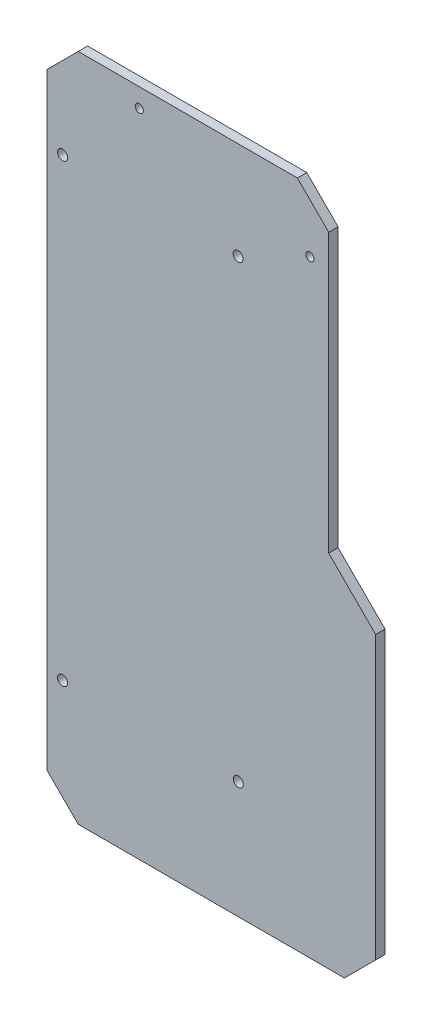
ISO-10303-21;
HEADER;
FILE_DESCRIPTION(('STEP AP214'),'2;1');
FILE_NAME('part.step','',(''),(''),'','','');
FILE_SCHEMA(('AUTOMOTIVE_DESIGN { 1 0 10303 214 1 1 1 1 }'));
ENDSEC;
DATA;
#1=APPLICATION_CONTEXT('core data for automotive mechanical design processes');
#2=APPLICATION_PROTOCOL_DEFINITION('international standard','automotive_design',2000,#1);
#3=PRODUCT_CONTEXT('',#1,'mechanical');
#4=PRODUCT('Part','Part','',(#3));
#5=PRODUCT_RELATED_PRODUCT_CATEGORY('part','',(#4));
#6=PRODUCT_DEFINITION_FORMATION('','',#4);
#7=PRODUCT_DEFINITION_CONTEXT('part definition',#1,'design');
#8=PRODUCT_DEFINITION('design','',#6,#7);
#9=PRODUCT_DEFINITION_SHAPE('','',#8);
#10=(LENGTH_UNIT() NAMED_UNIT(*) SI_UNIT(.MILLI.,.METRE.));
#11=(NAMED_UNIT(*) PLANE_ANGLE_UNIT() SI_UNIT($,.RADIAN.));
#12=(NAMED_UNIT(*) SI_UNIT($,.STERADIAN.) SOLID_ANGLE_UNIT());
#13=UNCERTAINTY_MEASURE_WITH_UNIT(LENGTH_MEASURE(1.E-05),#10,'distance_accuracy_value','');
#14=(GEOMETRIC_REPRESENTATION_CONTEXT(3) GLOBAL_UNCERTAINTY_ASSIGNED_CONTEXT((#13)) GLOBAL_UNIT_ASSIGNED_CONTEXT((#10,
#11,#12)) REPRESENTATION_CONTEXT('',''));
#15=CARTESIAN_POINT('',(0.,0.,0.));
#16=DIRECTION('',(0.,0.,1.));
#17=DIRECTION('',(1.,0.,0.));
#18=AXIS2_PLACEMENT_3D('',#15,#16,#17);
#19=CARTESIAN_POINT('',(0.,0.,3.));
#20=DIRECTION('',(0.,0.,-1.));
#21=DIRECTION('',(-1.,0.,0.));
#22=AXIS2_PLACEMENT_3D('',#19,#20,#21);
#23=PLANE('',#22);
#24=DIRECTION('',(0.707106781186546,-0.707106781186548,0.));
#25=VECTOR('',#24,1.);
#26=CARTESIAN_POINT('',(-80.0000000000499,-169.75395984717,3.));
#27=LINE('',#26,#25);
#28=CARTESIAN_POINT('',(-80.0000000000499,-169.75395984717,3.));
#29=VERTEX_POINT('',#28);
#30=CARTESIAN_POINT('',(-70.0000000000499,-179.75395984717,3.));
#31=VERTEX_POINT('',#30);
#32=EDGE_CURVE('E161',#29,#31,#27,.T.);
#33=ORIENTED_EDGE('',*,*,#32,.T.);
#34=DIRECTION('',(1.,0.,0.));
#35=VECTOR('',#34,1.);
#36=CARTESIAN_POINT('',(-70.0000000000499,-179.75395984717,3.));
#37=LINE('',#36,#35);
#38=CARTESIAN_POINT('',(14.9999999999501,-179.75395984717,3.));
#39=VERTEX_POINT('',#38);
#40=EDGE_CURVE('E99',#31,#39,#37,.T.);
#41=ORIENTED_EDGE('',*,*,#40,.T.);
#42=DIRECTION('',(0.707106781186547,0.707106781186548,0.));
#43=VECTOR('',#42,1.);
#44=CARTESIAN_POINT('',(24.9999999999501,-169.75395984717,3.));
#45=LINE('',#44,#43);
#46=CARTESIAN_POINT('',(24.9999999999501,-169.75395984717,3.));
#47=VERTEX_POINT('',#46);
#48=EDGE_CURVE('E182',#39,#47,#45,.T.);
#49=ORIENTED_EDGE('',*,*,#48,.T.);
#50=DIRECTION('',(0.,1.,0.));
#51=VECTOR('',#50,1.);
#52=CARTESIAN_POINT('',(24.9999999999501,-79.7539598471698,3.));
#53=LINE('',#52,#51);
#54=CARTESIAN_POINT('',(24.9999999999501,-79.7539598471698,3.));
#55=VERTEX_POINT('',#54);
#56=EDGE_CURVE('E201',#47,#55,#53,.T.);
#57=ORIENTED_EDGE('',*,*,#56,.T.);
#58=DIRECTION('',(-0.707106781186544,0.707106781186551,0.));
#59=VECTOR('',#58,1.);
#60=CARTESIAN_POINT('',(9.99999999995006,-64.7539598471697,3.));
#61=LINE('',#60,#59);
#62=CARTESIAN_POINT('',(9.99999999995006,-64.7539598471697,3.));
#63=VERTEX_POINT('',#62);
#64=EDGE_CURVE('E198',#55,#63,#61,.T.);
#65=ORIENTED_EDGE('',*,*,#64,.T.);
#66=DIRECTION('',(0.,1.,0.));
#67=VECTOR('',#66,1.);
#68=CARTESIAN_POINT('',(9.99999999995006,-64.7539598471697,3.));
#69=LINE('',#68,#67);
#70=CARTESIAN_POINT('',(9.99999999995006,24.0035457810133,3.));
#71=VERTEX_POINT('',#70);
#72=EDGE_CURVE('E200',#63,#71,#69,.T.);
#73=ORIENTED_EDGE('',*,*,#72,.T.);
#74=DIRECTION('',(-0.707106781186548,0.707106781186548,0.));
#75=VECTOR('',#74,1.);
#76=CARTESIAN_POINT('',(9.99999999995006,24.0035457810133,3.));
#77=LINE('',#76,#75);
#78=CARTESIAN_POINT('',(-4.99374847029443E-11,34.0035457810133,3.));
#79=VERTEX_POINT('',#78);
#80=EDGE_CURVE('E124',#71,#79,#77,.T.);
#81=ORIENTED_EDGE('',*,*,#80,.T.);
#82=DIRECTION('',(-1.,0.,0.));
#83=VECTOR('',#82,1.);
#84=CARTESIAN_POINT('',(-70.00000000005,34.0035457810133,3.));
#85=LINE('',#84,#83);
#86=CARTESIAN_POINT('',(-70.00000000005,34.0035457810133,3.));
#87=VERTEX_POINT('',#86);
#88=EDGE_CURVE('E118',#79,#87,#85,.T.);
#89=ORIENTED_EDGE('',*,*,#88,.T.);
#90=DIRECTION('',(-0.707106781186547,-0.707106781186548,0.));
#91=VECTOR('',#90,1.);
#92=CARTESIAN_POINT('',(-80.00000000005,24.0035457810133,3.));
#93=LINE('',#92,#91);
#94=CARTESIAN_POINT('',(-80.00000000005,24.0035457810133,3.));
#95=VERTEX_POINT('',#94);
#96=EDGE_CURVE('E122',#87,#95,#93,.T.);
#97=ORIENTED_EDGE('',*,*,#96,.T.);
#98=DIRECTION('',(0.,-1.,0.));
#99=VECTOR('',#98,1.);
#100=CARTESIAN_POINT('',(-80.00000000005,24.0035457810133,3.));
#101=LINE('',#100,#99);
#102=EDGE_CURVE('E50',#95,#29,#101,.T.);
#103=ORIENTED_EDGE('',*,*,#102,.T.);
#104=EDGE_LOOP('',(#33,#41,#49,#57,#65,#73,#81,#89,#97,#103));
#105=FACE_BOUND('',#104,.T.);
#106=CARTESIAN_POINT('',(-75.0000000000499,2.89354578101323,3.));
#107=DIRECTION('',(0.,0.,1.));
#108=DIRECTION('',(1.,0.,0.));
#109=AXIS2_PLACEMENT_3D('',#106,#107,#108);
#110=CIRCLE('',#109,1.60000000000001);
#111=CARTESIAN_POINT('',(-73.4000000000499,2.89354578101323,3.));
#112=VERTEX_POINT('',#111);
#113=EDGE_CURVE('E146',#112,#112,#110,.T.);
#114=ORIENTED_EDGE('',*,*,#113,.F.);
#115=EDGE_LOOP('',(#114));
#116=FACE_BOUND('',#115,.T.);
#117=CARTESIAN_POINT('',(-18.9466327709012,2.89354578101323,3.));
#118=DIRECTION('',(0.,0.,1.));
#119=DIRECTION('',(1.,0.,0.));
#120=AXIS2_PLACEMENT_3D('',#117,#118,#119);
#121=CIRCLE('',#120,1.6);
#122=CARTESIAN_POINT('',(-17.3466327709012,2.89354578101323,3.));
#123=VERTEX_POINT('',#122);
#124=EDGE_CURVE('E212',#123,#123,#121,.T.);
#125=ORIENTED_EDGE('',*,*,#124,.F.);
#126=EDGE_LOOP('',(#125));
#127=FACE_BOUND('',#126,.T.);
#128=CARTESIAN_POINT('',(-75.0000000000499,-142.40395984717,3.));
#129=DIRECTION('',(0.,0.,1.));
#130=DIRECTION('',(1.,0.,0.));
#131=AXIS2_PLACEMENT_3D('',#128,#129,#130);
#132=CIRCLE('',#131,1.6);
#133=CARTESIAN_POINT('',(-73.4000000000499,-142.40395984717,3.));
#134=VERTEX_POINT('',#133);
#135=EDGE_CURVE('E218',#134,#134,#132,.T.);
#136=ORIENTED_EDGE('',*,*,#135,.F.);
#137=EDGE_LOOP('',(#136));
#138=FACE_BOUND('',#137,.T.);
#139=CARTESIAN_POINT('',(-18.8931643638833,-142.40395984717,3.));
#140=DIRECTION('',(0.,0.,1.));
#141=DIRECTION('',(1.,0.,0.));
#142=AXIS2_PLACEMENT_3D('',#139,#140,#141);
#143=CIRCLE('',#142,1.6);
#144=CARTESIAN_POINT('',(-17.2931643638833,-142.40395984717,3.));
#145=VERTEX_POINT('',#144);
#146=EDGE_CURVE('E224',#145,#145,#143,.T.);
#147=ORIENTED_EDGE('',*,*,#146,.F.);
#148=EDGE_LOOP('',(#147));
#149=FACE_BOUND('',#148,.T.);
#150=CARTESIAN_POINT('',(3.99999999995007,14.2435457810134,3.));
#151=DIRECTION('',(0.,0.,1.));
#152=DIRECTION('',(1.,0.,0.));
#153=AXIS2_PLACEMENT_3D('',#150,#151,#152);
#154=CIRCLE('',#153,1.3);
#155=CARTESIAN_POINT('',(5.29999999995007,14.2435457810134,3.));
#156=VERTEX_POINT('',#155);
#157=EDGE_CURVE('E230',#156,#156,#154,.T.);
#158=ORIENTED_EDGE('',*,*,#157,.F.);
#159=EDGE_LOOP('',(#158));
#160=FACE_BOUND('',#159,.T.);
#161=CARTESIAN_POINT('',(-50.4999999999999,28.0035457810133,3.));
#162=DIRECTION('',(0.,0.,1.));
#163=DIRECTION('',(1.,0.,0.));
#164=AXIS2_PLACEMENT_3D('',#161,#162,#163);
#165=CIRCLE('',#164,1.3);
#166=CARTESIAN_POINT('',(-49.1999999999999,28.0035457810133,3.));
#167=VERTEX_POINT('',#166);
#168=EDGE_CURVE('E236',#167,#167,#165,.T.);
#169=ORIENTED_EDGE('',*,*,#168,.F.);
#170=EDGE_LOOP('',(#169));
#171=FACE_BOUND('',#170,.T.);
#172=ADVANCED_FACE('F33',(#105,#116,#127,#138,#149,#160,#171),#23,.F.);
#173=CARTESIAN_POINT('',(0.,0.,0.));
#174=DIRECTION('',(0.,0.,-1.));
#175=DIRECTION('',(-1.,0.,0.));
#176=AXIS2_PLACEMENT_3D('',#173,#174,#175);
#177=PLANE('',#176);
#178=CARTESIAN_POINT('',(3.99999999995007,14.2435457810134,0.));
#179=DIRECTION('',(0.,0.,1.));
#180=DIRECTION('',(1.,0.,0.));
#181=AXIS2_PLACEMENT_3D('',#178,#179,#180);
#182=CIRCLE('',#181,1.3);
#183=CARTESIAN_POINT('',(5.29999999995007,14.2435457810134,0.));
#184=VERTEX_POINT('',#183);
#185=EDGE_CURVE('E233',#184,#184,#182,.T.);
#186=ORIENTED_EDGE('',*,*,#185,.T.);
#187=EDGE_LOOP('',(#186));
#188=FACE_BOUND('',#187,.T.);
#189=CARTESIAN_POINT('',(-75.0000000000499,-142.40395984717,0.));
#190=DIRECTION('',(0.,0.,1.));
#191=DIRECTION('',(1.,0.,0.));
#192=AXIS2_PLACEMENT_3D('',#189,#190,#191);
#193=CIRCLE('',#192,1.6);
#194=CARTESIAN_POINT('',(-73.4000000000499,-142.40395984717,0.));
#195=VERTEX_POINT('',#194);
#196=EDGE_CURVE('E221',#195,#195,#193,.T.);
#197=ORIENTED_EDGE('',*,*,#196,.T.);
#198=EDGE_LOOP('',(#197));
#199=FACE_BOUND('',#198,.T.);
#200=CARTESIAN_POINT('',(-75.0000000000499,2.89354578101323,0.));
#201=DIRECTION('',(0.,0.,1.));
#202=DIRECTION('',(1.,0.,0.));
#203=AXIS2_PLACEMENT_3D('',#200,#201,#202);
#204=CIRCLE('',#203,1.60000000000001);
#205=CARTESIAN_POINT('',(-73.4000000000499,2.89354578101323,0.));
#206=VERTEX_POINT('',#205);
#207=EDGE_CURVE('E209',#206,#206,#204,.T.);
#208=ORIENTED_EDGE('',*,*,#207,.T.);
#209=EDGE_LOOP('',(#208));
#210=FACE_BOUND('',#209,.T.);
#211=DIRECTION('',(0.707106781186546,-0.707106781186548,0.));
#212=VECTOR('',#211,1.);
#213=CARTESIAN_POINT('',(-80.0000000000499,-169.75395984717,0.));
#214=LINE('',#213,#212);
#215=CARTESIAN_POINT('',(-80.0000000000499,-169.75395984717,0.));
#216=VERTEX_POINT('',#215);
#217=CARTESIAN_POINT('',(-70.0000000000499,-179.75395984717,0.));
#218=VERTEX_POINT('',#217);
#219=EDGE_CURVE('E142',#216,#218,#214,.T.);
#220=ORIENTED_EDGE('',*,*,#219,.F.);
#221=DIRECTION('',(0.,-1.,0.));
#222=VECTOR('',#221,1.);
#223=CARTESIAN_POINT('',(-80.00000000005,24.0035457810133,0.));
#224=LINE('',#223,#222);
#225=CARTESIAN_POINT('',(-80.00000000005,24.0035457810133,0.));
#226=VERTEX_POINT('',#225);
#227=EDGE_CURVE('E91',#226,#216,#224,.T.);
#228=ORIENTED_EDGE('',*,*,#227,.F.);
#229=DIRECTION('',(-0.707106781186547,-0.707106781186548,0.));
#230=VECTOR('',#229,1.);
#231=CARTESIAN_POINT('',(-80.00000000005,24.0035457810133,0.));
#232=LINE('',#231,#230);
#233=CARTESIAN_POINT('',(-70.00000000005,34.0035457810133,0.));
#234=VERTEX_POINT('',#233);
#235=EDGE_CURVE('E85',#234,#226,#232,.T.);
#236=ORIENTED_EDGE('',*,*,#235,.F.);
#237=DIRECTION('',(-1.,0.,0.));
#238=VECTOR('',#237,1.);
#239=CARTESIAN_POINT('',(-70.00000000005,34.0035457810133,0.));
#240=LINE('',#239,#238);
#241=CARTESIAN_POINT('',(-4.99374847029443E-11,34.0035457810133,0.));
#242=VERTEX_POINT('',#241);
#243=EDGE_CURVE('E132',#242,#234,#240,.T.);
#244=ORIENTED_EDGE('',*,*,#243,.F.);
#245=DIRECTION('',(-0.707106781186548,0.707106781186548,0.));
#246=VECTOR('',#245,1.);
#247=CARTESIAN_POINT('',(9.99999999995006,24.0035457810133,0.));
#248=LINE('',#247,#246);
#249=CARTESIAN_POINT('',(9.99999999995006,24.0035457810133,0.));
#250=VERTEX_POINT('',#249);
#251=EDGE_CURVE('E156',#250,#242,#248,.T.);
#252=ORIENTED_EDGE('',*,*,#251,.F.);
#253=DIRECTION('',(0.,1.,0.));
#254=VECTOR('',#253,1.);
#255=CARTESIAN_POINT('',(9.99999999995006,-64.7539598471697,0.));
#256=LINE('',#255,#254);
#257=CARTESIAN_POINT('',(9.99999999995006,-64.7539598471697,0.));
#258=VERTEX_POINT('',#257);
#259=EDGE_CURVE('E154',#258,#250,#256,.T.);
#260=ORIENTED_EDGE('',*,*,#259,.F.);
#261=DIRECTION('',(-0.707106781186544,0.707106781186551,0.));
#262=VECTOR('',#261,1.);
#263=CARTESIAN_POINT('',(9.99999999995006,-64.7539598471697,0.));
#264=LINE('',#263,#262);
#265=CARTESIAN_POINT('',(24.9999999999501,-79.7539598471698,0.));
#266=VERTEX_POINT('',#265);
#267=EDGE_CURVE('E152',#266,#258,#264,.T.);
#268=ORIENTED_EDGE('',*,*,#267,.F.);
#269=DIRECTION('',(0.,1.,0.));
#270=VECTOR('',#269,1.);
#271=CARTESIAN_POINT('',(24.9999999999501,-79.7539598471698,0.));
#272=LINE('',#271,#270);
#273=CARTESIAN_POINT('',(24.9999999999501,-169.75395984717,0.));
#274=VERTEX_POINT('',#273);
#275=EDGE_CURVE('E150',#274,#266,#272,.T.);
#276=ORIENTED_EDGE('',*,*,#275,.F.);
#277=DIRECTION('',(0.707106781186547,0.707106781186548,0.));
#278=VECTOR('',#277,1.);
#279=CARTESIAN_POINT('',(24.9999999999501,-169.75395984717,0.));
#280=LINE('',#279,#278);
#281=CARTESIAN_POINT('',(14.9999999999501,-179.75395984717,0.));
#282=VERTEX_POINT('',#281);
#283=EDGE_CURVE('E148',#282,#274,#280,.T.);
#284=ORIENTED_EDGE('',*,*,#283,.F.);
#285=DIRECTION('',(1.,0.,0.));
#286=VECTOR('',#285,1.);
#287=CARTESIAN_POINT('',(14.9999999999501,-179.75395984717,0.));
#288=LINE('',#287,#286);
#289=EDGE_CURVE('E145',#218,#282,#288,.T.);
#290=ORIENTED_EDGE('',*,*,#289,.F.);
#291=EDGE_LOOP('',(#220,#228,#236,#244,#252,#260,#268,#276,#284,#290));
#292=FACE_BOUND('',#291,.T.);
#293=CARTESIAN_POINT('',(-18.9466327709012,2.89354578101323,0.));
#294=DIRECTION('',(0.,0.,1.));
#295=DIRECTION('',(1.,0.,0.));
#296=AXIS2_PLACEMENT_3D('',#293,#294,#295);
#297=CIRCLE('',#296,1.6);
#298=CARTESIAN_POINT('',(-17.3466327709012,2.89354578101323,0.));
#299=VERTEX_POINT('',#298);
#300=EDGE_CURVE('E215',#299,#299,#297,.T.);
#301=ORIENTED_EDGE('',*,*,#300,.T.);
#302=EDGE_LOOP('',(#301));
#303=FACE_BOUND('',#302,.T.);
#304=CARTESIAN_POINT('',(-18.8931643638833,-142.40395984717,0.));
#305=DIRECTION('',(0.,0.,1.));
#306=DIRECTION('',(1.,0.,0.));
#307=AXIS2_PLACEMENT_3D('',#304,#305,#306);
#308=CIRCLE('',#307,1.6);
#309=CARTESIAN_POINT('',(-17.2931643638833,-142.40395984717,0.));
#310=VERTEX_POINT('',#309);
#311=EDGE_CURVE('E227',#310,#310,#308,.T.);
#312=ORIENTED_EDGE('',*,*,#311,.T.);
#313=EDGE_LOOP('',(#312));
#314=FACE_BOUND('',#313,.T.);
#315=CARTESIAN_POINT('',(-50.4999999999999,28.0035457810133,0.));
#316=DIRECTION('',(0.,0.,1.));
#317=DIRECTION('',(1.,0.,0.));
#318=AXIS2_PLACEMENT_3D('',#315,#316,#317);
#319=CIRCLE('',#318,1.3);
#320=CARTESIAN_POINT('',(-49.1999999999999,28.0035457810133,0.));
#321=VERTEX_POINT('',#320);
#322=EDGE_CURVE('E239',#321,#321,#319,.T.);
#323=ORIENTED_EDGE('',*,*,#322,.T.);
#324=EDGE_LOOP('',(#323));
#325=FACE_BOUND('',#324,.T.);
#326=ADVANCED_FACE('F186',(#188,#199,#210,#292,#303,#314,#325),#177,.T.);
#327=CARTESIAN_POINT('',(-80.0000000000499,-169.75395984717,3.));
#328=DIRECTION('',(0.707106781186549,0.707106781186547,0.));
#329=DIRECTION('',(-0.707106781186547,0.707106781186549,0.));
#330=AXIS2_PLACEMENT_3D('',#327,#328,#329);
#331=PLANE('',#330);
#332=ORIENTED_EDGE('',*,*,#219,.T.);
#333=DIRECTION('',(0.,0.,-1.));
#334=VECTOR('',#333,1.);
#335=CARTESIAN_POINT('',(-70.0000000000499,-179.75395984717,3.));
#336=LINE('',#335,#334);
#337=EDGE_CURVE('E11',#31,#218,#336,.T.);
#338=ORIENTED_EDGE('',*,*,#337,.F.);
#339=ORIENTED_EDGE('',*,*,#32,.F.);
#340=DIRECTION('',(0.,0.,-1.));
#341=VECTOR('',#340,1.);
#342=CARTESIAN_POINT('',(-80.0000000000499,-169.75395984717,3.));
#343=LINE('',#342,#341);
#344=EDGE_CURVE('E138',#29,#216,#343,.T.);
#345=ORIENTED_EDGE('',*,*,#344,.T.);
#346=EDGE_LOOP('',(#332,#338,#339,#345));
#347=FACE_BOUND('',#346,.T.);
#348=ADVANCED_FACE('F35',(#347),#331,.F.);
#349=CARTESIAN_POINT('',(14.9999999999501,-179.75395984717,3.));
#350=DIRECTION('',(0.,1.,0.));
#351=DIRECTION('',(0.,0.,1.));
#352=AXIS2_PLACEMENT_3D('',#349,#350,#351);
#353=PLANE('',#352);
#354=ORIENTED_EDGE('',*,*,#289,.T.);
#355=DIRECTION('',(0.,0.,-1.));
#356=VECTOR('',#355,1.);
#357=CARTESIAN_POINT('',(14.9999999999501,-179.75395984717,3.));
#358=LINE('',#357,#356);
#359=EDGE_CURVE('E42',#39,#282,#358,.T.);
#360=ORIENTED_EDGE('',*,*,#359,.F.);
#361=ORIENTED_EDGE('',*,*,#40,.F.);
#362=ORIENTED_EDGE('',*,*,#337,.T.);
#363=EDGE_LOOP('',(#354,#360,#361,#362));
#364=FACE_BOUND('',#363,.T.);
#365=ADVANCED_FACE('F279',(#364),#353,.F.);
#366=CARTESIAN_POINT('',(24.9999999999501,-169.75395984717,3.));
#367=DIRECTION('',(-0.707106781186548,0.707106781186547,0.));
#368=DIRECTION('',(-0.707106781186547,-0.707106781186548,0.));
#369=AXIS2_PLACEMENT_3D('',#366,#367,#368);
#370=PLANE('',#369);
#371=ORIENTED_EDGE('',*,*,#283,.T.);
#372=DIRECTION('',(0.,0.,-1.));
#373=VECTOR('',#372,1.);
#374=CARTESIAN_POINT('',(24.9999999999501,-169.75395984717,3.));
#375=LINE('',#374,#373);
#376=EDGE_CURVE('E174',#47,#274,#375,.T.);
#377=ORIENTED_EDGE('',*,*,#376,.F.);
#378=ORIENTED_EDGE('',*,*,#48,.F.);
#379=ORIENTED_EDGE('',*,*,#359,.T.);
#380=EDGE_LOOP('',(#371,#377,#378,#379));
#381=FACE_BOUND('',#380,.T.);
#382=ADVANCED_FACE('F180',(#381),#370,.F.);
#383=CARTESIAN_POINT('',(24.9999999999501,-79.7539598471698,3.));
#384=DIRECTION('',(-1.,0.,0.));
#385=DIRECTION('',(0.,-1.,0.));
#386=AXIS2_PLACEMENT_3D('',#383,#384,#385);
#387=PLANE('',#386);
#388=ORIENTED_EDGE('',*,*,#275,.T.);
#389=DIRECTION('',(0.,0.,-1.));
#390=VECTOR('',#389,1.);
#391=CARTESIAN_POINT('',(24.9999999999501,-79.7539598471698,3.));
#392=LINE('',#391,#390);
#393=EDGE_CURVE('E171',#55,#266,#392,.T.);
#394=ORIENTED_EDGE('',*,*,#393,.F.);
#395=ORIENTED_EDGE('',*,*,#56,.F.);
#396=ORIENTED_EDGE('',*,*,#376,.T.);
#397=EDGE_LOOP('',(#388,#394,#395,#396));
#398=FACE_BOUND('',#397,.T.);
#399=ADVANCED_FACE('F192',(#398),#387,.F.);
#400=CARTESIAN_POINT('',(9.99999999995006,-64.7539598471697,3.));
#401=DIRECTION('',(-0.707106781186551,-0.707106781186544,0.));
#402=DIRECTION('',(0.707106781186544,-0.707106781186551,0.));
#403=AXIS2_PLACEMENT_3D('',#400,#401,#402);
#404=PLANE('',#403);
#405=ORIENTED_EDGE('',*,*,#267,.T.);
#406=DIRECTION('',(0.,0.,-1.));
#407=VECTOR('',#406,1.);
#408=CARTESIAN_POINT('',(9.99999999995006,-64.7539598471697,3.));
#409=LINE('',#408,#407);
#410=EDGE_CURVE('E168',#63,#258,#409,.T.);
#411=ORIENTED_EDGE('',*,*,#410,.F.);
#412=ORIENTED_EDGE('',*,*,#64,.F.);
#413=ORIENTED_EDGE('',*,*,#393,.T.);
#414=EDGE_LOOP('',(#405,#411,#412,#413));
#415=FACE_BOUND('',#414,.T.);
#416=ADVANCED_FACE('F196',(#415),#404,.F.);
#417=CARTESIAN_POINT('',(9.99999999995006,-64.7539598471697,3.));
#418=DIRECTION('',(-1.,0.,0.));
#419=DIRECTION('',(0.,-1.,0.));
#420=AXIS2_PLACEMENT_3D('',#417,#418,#419);
#421=PLANE('',#420);
#422=ORIENTED_EDGE('',*,*,#259,.T.);
#423=DIRECTION('',(0.,0.,-1.));
#424=VECTOR('',#423,1.);
#425=CARTESIAN_POINT('',(9.99999999995006,24.0035457810133,3.));
#426=LINE('',#425,#424);
#427=EDGE_CURVE('E165',#71,#250,#426,.T.);
#428=ORIENTED_EDGE('',*,*,#427,.F.);
#429=ORIENTED_EDGE('',*,*,#72,.F.);
#430=ORIENTED_EDGE('',*,*,#410,.T.);
#431=EDGE_LOOP('',(#422,#428,#429,#430));
#432=FACE_BOUND('',#431,.T.);
#433=ADVANCED_FACE('F269',(#432),#421,.F.);
#434=CARTESIAN_POINT('',(9.99999999995006,24.0035457810133,3.));
#435=DIRECTION('',(-0.707106781186547,-0.707106781186547,0.));
#436=DIRECTION('',(0.707106781186548,-0.707106781186548,0.));
#437=AXIS2_PLACEMENT_3D('',#434,#435,#436);
#438=PLANE('',#437);
#439=ORIENTED_EDGE('',*,*,#251,.T.);
#440=DIRECTION('',(0.,0.,-1.));
#441=VECTOR('',#440,1.);
#442=CARTESIAN_POINT('',(-4.99374847029443E-11,34.0035457810133,3.));
#443=LINE('',#442,#441);
#444=EDGE_CURVE('E133',#79,#242,#443,.T.);
#445=ORIENTED_EDGE('',*,*,#444,.F.);
#446=ORIENTED_EDGE('',*,*,#80,.F.);
#447=ORIENTED_EDGE('',*,*,#427,.T.);
#448=EDGE_LOOP('',(#439,#445,#446,#447));
#449=FACE_BOUND('',#448,.T.);
#450=ADVANCED_FACE('F266',(#449),#438,.F.);
#451=CARTESIAN_POINT('',(-70.00000000005,34.0035457810133,3.));
#452=DIRECTION('',(0.,-1.,0.));
#453=DIRECTION('',(0.,0.,-1.));
#454=AXIS2_PLACEMENT_3D('',#451,#452,#453);
#455=PLANE('',#454);
#456=ORIENTED_EDGE('',*,*,#243,.T.);
#457=DIRECTION('',(0.,0.,-1.));
#458=VECTOR('',#457,1.);
#459=CARTESIAN_POINT('',(-70.00000000005,34.0035457810133,3.));
#460=LINE('',#459,#458);
#461=EDGE_CURVE('E129',#87,#234,#460,.T.);
#462=ORIENTED_EDGE('',*,*,#461,.F.);
#463=ORIENTED_EDGE('',*,*,#88,.F.);
#464=ORIENTED_EDGE('',*,*,#444,.T.);
#465=EDGE_LOOP('',(#456,#462,#463,#464));
#466=FACE_BOUND('',#465,.T.);
#467=ADVANCED_FACE('F130',(#466),#455,.F.);
#468=CARTESIAN_POINT('',(-80.00000000005,24.0035457810133,3.));
#469=DIRECTION('',(0.707106781186548,-0.707106781186547,0.));
#470=DIRECTION('',(0.707106781186547,0.707106781186548,0.));
#471=AXIS2_PLACEMENT_3D('',#468,#469,#470);
#472=PLANE('',#471);
#473=ORIENTED_EDGE('',*,*,#235,.T.);
#474=DIRECTION('',(0.,0.,-1.));
#475=VECTOR('',#474,1.);
#476=CARTESIAN_POINT('',(-80.00000000005,24.0035457810133,3.));
#477=LINE('',#476,#475);
#478=EDGE_CURVE('E134',#95,#226,#477,.T.);
#479=ORIENTED_EDGE('',*,*,#478,.F.);
#480=ORIENTED_EDGE('',*,*,#96,.F.);
#481=ORIENTED_EDGE('',*,*,#461,.T.);
#482=EDGE_LOOP('',(#473,#479,#480,#481));
#483=FACE_BOUND('',#482,.T.);
#484=ADVANCED_FACE('F136',(#483),#472,.F.);
#485=CARTESIAN_POINT('',(-80.00000000005,24.0035457810133,3.));
#486=DIRECTION('',(1.,0.,0.));
#487=DIRECTION('',(0.,1.,0.));
#488=AXIS2_PLACEMENT_3D('',#485,#486,#487);
#489=PLANE('',#488);
#490=ORIENTED_EDGE('',*,*,#227,.T.);
#491=ORIENTED_EDGE('',*,*,#344,.F.);
#492=ORIENTED_EDGE('',*,*,#102,.F.);
#493=ORIENTED_EDGE('',*,*,#478,.T.);
#494=EDGE_LOOP('',(#490,#491,#492,#493));
#495=FACE_BOUND('',#494,.T.);
#496=ADVANCED_FACE('F259',(#495),#489,.F.);
#497=CARTESIAN_POINT('',(-75.0000000000499,2.89354578101323,3.));
#498=DIRECTION('',(0.,0.,-1.));
#499=DIRECTION('',(-1.,0.,0.));
#500=AXIS2_PLACEMENT_3D('',#497,#498,#499);
#501=CYLINDRICAL_SURFACE('',#500,1.60000000000001);
#502=ORIENTED_EDGE('',*,*,#113,.T.);
#503=EDGE_LOOP('',(#502));
#504=FACE_BOUND('',#503,.T.);
#505=ORIENTED_EDGE('',*,*,#207,.F.);
#506=EDGE_LOOP('',(#505));
#507=FACE_BOUND('',#506,.T.);
#508=ADVANCED_FACE('F256',(#504,#507),#501,.F.);
#509=CARTESIAN_POINT('',(-18.9466327709012,2.89354578101323,3.));
#510=DIRECTION('',(0.,0.,-1.));
#511=DIRECTION('',(-1.,0.,0.));
#512=AXIS2_PLACEMENT_3D('',#509,#510,#511);
#513=CYLINDRICAL_SURFACE('',#512,1.6);
#514=ORIENTED_EDGE('',*,*,#124,.T.);
#515=EDGE_LOOP('',(#514));
#516=FACE_BOUND('',#515,.T.);
#517=ORIENTED_EDGE('',*,*,#300,.F.);
#518=EDGE_LOOP('',(#517));
#519=FACE_BOUND('',#518,.T.);
#520=ADVANCED_FACE('F358',(#516,#519),#513,.F.);
#521=CARTESIAN_POINT('',(-75.0000000000499,-142.40395984717,3.));
#522=DIRECTION('',(0.,0.,-1.));
#523=DIRECTION('',(-1.,0.,0.));
#524=AXIS2_PLACEMENT_3D('',#521,#522,#523);
#525=CYLINDRICAL_SURFACE('',#524,1.6);
#526=ORIENTED_EDGE('',*,*,#135,.T.);
#527=EDGE_LOOP('',(#526));
#528=FACE_BOUND('',#527,.T.);
#529=ORIENTED_EDGE('',*,*,#196,.F.);
#530=EDGE_LOOP('',(#529));
#531=FACE_BOUND('',#530,.T.);
#532=ADVANCED_FACE('F366',(#528,#531),#525,.F.);
#533=CARTESIAN_POINT('',(-18.8931643638833,-142.40395984717,3.));
#534=DIRECTION('',(0.,0.,-1.));
#535=DIRECTION('',(-1.,0.,0.));
#536=AXIS2_PLACEMENT_3D('',#533,#534,#535);
#537=CYLINDRICAL_SURFACE('',#536,1.6);
#538=ORIENTED_EDGE('',*,*,#146,.T.);
#539=EDGE_LOOP('',(#538));
#540=FACE_BOUND('',#539,.T.);
#541=ORIENTED_EDGE('',*,*,#311,.F.);
#542=EDGE_LOOP('',(#541));
#543=FACE_BOUND('',#542,.T.);
#544=ADVANCED_FACE('F374',(#540,#543),#537,.F.);
#545=CARTESIAN_POINT('',(3.99999999995007,14.2435457810134,3.));
#546=DIRECTION('',(0.,0.,-1.));
#547=DIRECTION('',(-1.,0.,0.));
#548=AXIS2_PLACEMENT_3D('',#545,#546,#547);
#549=CYLINDRICAL_SURFACE('',#548,1.3);
#550=ORIENTED_EDGE('',*,*,#157,.T.);
#551=EDGE_LOOP('',(#550));
#552=FACE_BOUND('',#551,.T.);
#553=ORIENTED_EDGE('',*,*,#185,.F.);
#554=EDGE_LOOP('',(#553));
#555=FACE_BOUND('',#554,.T.);
#556=ADVANCED_FACE('F383',(#552,#555),#549,.F.);
#557=CARTESIAN_POINT('',(-50.4999999999999,28.0035457810133,3.));
#558=DIRECTION('',(0.,0.,-1.));
#559=DIRECTION('',(-1.,0.,0.));
#560=AXIS2_PLACEMENT_3D('',#557,#558,#559);
#561=CYLINDRICAL_SURFACE('',#560,1.3);
#562=ORIENTED_EDGE('',*,*,#168,.T.);
#563=EDGE_LOOP('',(#562));
#564=FACE_BOUND('',#563,.T.);
#565=ORIENTED_EDGE('',*,*,#322,.F.);
#566=EDGE_LOOP('',(#565));
#567=FACE_BOUND('',#566,.T.);
#568=ADVANCED_FACE('F245',(#564,#567),#561,.F.);
#569=CLOSED_SHELL('',(#172,#326,#348,#365,#382,#399,#416,#433,#450,#467,#484,#496,#508,#520,
#532,#544,#556,#568));
#570=MANIFOLD_SOLID_BREP('B2',#569);
#571=ADVANCED_BREP_SHAPE_REPRESENTATION('',(#18,#570),#14);
#572=SHAPE_DEFINITION_REPRESENTATION(#9,#571);
ENDSEC;
END-ISO-10303-21;
